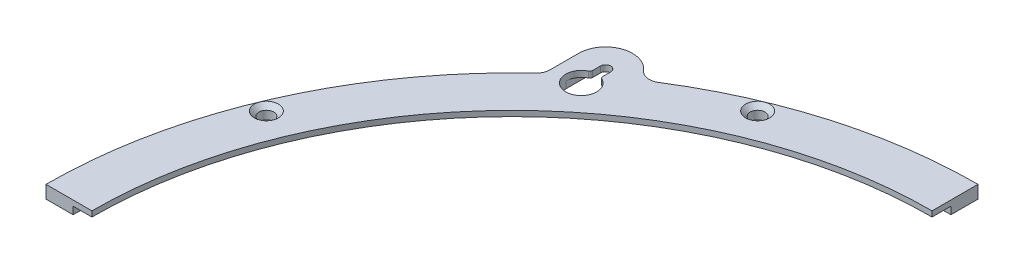
ISO-10303-21;
HEADER;
FILE_DESCRIPTION(('STEP AP214'),'2;1');
FILE_NAME('part.step','',(''),(''),'','','');
FILE_SCHEMA(('AUTOMOTIVE_DESIGN { 1 0 10303 214 1 1 1 1 }'));
ENDSEC;
DATA;
#1=APPLICATION_CONTEXT('core data for automotive mechanical design processes');
#2=APPLICATION_PROTOCOL_DEFINITION('international standard','automotive_design',2000,#1);
#3=PRODUCT_CONTEXT('',#1,'mechanical');
#4=PRODUCT('Part','Part','',(#3));
#5=PRODUCT_RELATED_PRODUCT_CATEGORY('part','',(#4));
#6=PRODUCT_DEFINITION_FORMATION('','',#4);
#7=PRODUCT_DEFINITION_CONTEXT('part definition',#1,'design');
#8=PRODUCT_DEFINITION('design','',#6,#7);
#9=PRODUCT_DEFINITION_SHAPE('','',#8);
#10=(LENGTH_UNIT() NAMED_UNIT(*) SI_UNIT(.MILLI.,.METRE.));
#11=(NAMED_UNIT(*) PLANE_ANGLE_UNIT() SI_UNIT($,.RADIAN.));
#12=(NAMED_UNIT(*) SI_UNIT($,.STERADIAN.) SOLID_ANGLE_UNIT());
#13=UNCERTAINTY_MEASURE_WITH_UNIT(LENGTH_MEASURE(1.E-05),#10,'distance_accuracy_value','');
#14=(GEOMETRIC_REPRESENTATION_CONTEXT(3) GLOBAL_UNCERTAINTY_ASSIGNED_CONTEXT((#13)) GLOBAL_UNIT_ASSIGNED_CONTEXT((#10,
#11,#12)) REPRESENTATION_CONTEXT('',''));
#15=CARTESIAN_POINT('',(0.,0.,0.));
#16=DIRECTION('',(0.,0.,1.));
#17=DIRECTION('',(1.,0.,0.));
#18=AXIS2_PLACEMENT_3D('',#15,#16,#17);
#19=CARTESIAN_POINT('',(-105.914175625585,4.75000000000002,-140.552858300126));
#20=DIRECTION('',(0.,-1.,0.));
#21=DIRECTION('',(0.,0.,-1.));
#22=AXIS2_PLACEMENT_3D('',#19,#20,#21);
#23=CYLINDRICAL_SURFACE('',#22,1.905);
#24=CARTESIAN_POINT('',(-105.914175625585,2.5,-140.552858300126));
#25=DIRECTION('',(0.,1.,0.));
#26=DIRECTION('',(0.,0.,-1.));
#27=AXIS2_PLACEMENT_3D('',#24,#25,#26);
#28=CIRCLE('',#27,1.905);
#29=CARTESIAN_POINT('',(-107.819175625585,2.5,-140.552858300126));
#30=VERTEX_POINT('',#29);
#31=CARTESIAN_POINT('',(-104.009175625585,2.5,-140.552858300126));
#32=VERTEX_POINT('',#31);
#33=EDGE_CURVE('E238',#30,#32,#28,.F.);
#34=ORIENTED_EDGE('',*,*,#33,.T.);
#35=DIRECTION('',(0.,-1.,0.));
#36=VECTOR('',#35,1.);
#37=CARTESIAN_POINT('',(-104.009175625585,4.75000000000002,-140.552858300126));
#38=LINE('',#37,#36);
#39=CARTESIAN_POINT('',(-104.009175625585,4.75000000000002,-140.552858300126));
#40=VERTEX_POINT('',#39);
#41=EDGE_CURVE('E258',#40,#32,#38,.T.);
#42=ORIENTED_EDGE('',*,*,#41,.F.);
#43=CARTESIAN_POINT('',(-105.914175625585,4.75000000000002,-140.552858300126));
#44=DIRECTION('',(0.,1.,0.));
#45=DIRECTION('',(0.,0.,-1.));
#46=AXIS2_PLACEMENT_3D('',#43,#44,#45);
#47=CIRCLE('',#46,1.905);
#48=CARTESIAN_POINT('',(-107.819175625585,4.75000000000002,-140.552858300126));
#49=VERTEX_POINT('',#48);
#50=EDGE_CURVE('E244',#40,#49,#47,.T.);
#51=ORIENTED_EDGE('',*,*,#50,.T.);
#52=DIRECTION('',(0.,-1.,0.));
#53=VECTOR('',#52,1.);
#54=CARTESIAN_POINT('',(-107.819175625585,4.75000000000002,-140.552858300126));
#55=LINE('',#54,#53);
#56=EDGE_CURVE('E255',#49,#30,#55,.T.);
#57=ORIENTED_EDGE('',*,*,#56,.T.);
#58=EDGE_LOOP('',(#34,#42,#51,#57));
#59=FACE_BOUND('',#58,.T.);
#60=ADVANCED_FACE('F34',(#59),#23,.F.);
#61=CARTESIAN_POINT('',(-104.009175625585,4.75000000000002,-136.941011972768));
#62=DIRECTION('',(1.,0.,0.));
#63=DIRECTION('',(0.,0.,1.));
#64=AXIS2_PLACEMENT_3D('',#61,#62,#63);
#65=PLANE('',#64);
#66=DIRECTION('',(0.,0.,1.));
#67=VECTOR('',#66,1.);
#68=CARTESIAN_POINT('',(-104.009175625585,2.5,-136.941011972768));
#69=LINE('',#68,#67);
#70=CARTESIAN_POINT('',(-104.009175625585,2.5,-137.606964344787));
#71=VERTEX_POINT('',#70);
#72=EDGE_CURVE('E242',#32,#71,#69,.T.);
#73=ORIENTED_EDGE('',*,*,#72,.T.);
#74=DIRECTION('',(0.,-1.,0.));
#75=VECTOR('',#74,1.);
#76=CARTESIAN_POINT('',(-104.009175625585,4.75000000000002,-137.606964344787));
#77=LINE('',#76,#75);
#78=CARTESIAN_POINT('',(-104.009175625585,4.75000000000002,-137.606964344787));
#79=VERTEX_POINT('',#78);
#80=EDGE_CURVE('E57',#71,#79,#77,.F.);
#81=ORIENTED_EDGE('',*,*,#80,.T.);
#82=DIRECTION('',(0.,0.,-1.));
#83=VECTOR('',#82,1.);
#84=CARTESIAN_POINT('',(-104.009175625585,4.75000000000002,-136.941011972768));
#85=LINE('',#84,#83);
#86=EDGE_CURVE('E253',#79,#40,#85,.T.);
#87=ORIENTED_EDGE('',*,*,#86,.T.);
#88=ORIENTED_EDGE('',*,*,#41,.T.);
#89=EDGE_LOOP('',(#73,#81,#87,#88));
#90=FACE_BOUND('',#89,.T.);
#91=ADVANCED_FACE('F406',(#90),#65,.F.);
#92=CARTESIAN_POINT('',(-105.914175625585,4.75000000000002,-131.552858300126));
#93=DIRECTION('',(0.,-1.,0.));
#94=DIRECTION('',(0.,0.,-1.));
#95=AXIS2_PLACEMENT_3D('',#92,#93,#94);
#96=CYLINDRICAL_SURFACE('',#95,5.715);
#97=CARTESIAN_POINT('',(-105.914175625585,4.75000000000002,-131.552858300126));
#98=DIRECTION('',(0.,1.,0.));
#99=DIRECTION('',(0.,0.,-1.));
#100=AXIS2_PLACEMENT_3D('',#97,#98,#99);
#101=CIRCLE('',#100,5.715);
#102=CARTESIAN_POINT('',(-108.386562073836,4.75000000000002,-136.705384889141));
#103=VERTEX_POINT('',#102);
#104=CARTESIAN_POINT('',(-103.441789177335,4.75000000000002,-136.705384889141));
#105=VERTEX_POINT('',#104);
#106=EDGE_CURVE('E250',#103,#105,#101,.T.);
#107=ORIENTED_EDGE('',*,*,#106,.T.);
#108=DIRECTION('',(0.,-1.,0.));
#109=VECTOR('',#108,1.);
#110=CARTESIAN_POINT('',(-103.441789177335,4.75000000000002,-136.705384889141));
#111=LINE('',#110,#109);
#112=CARTESIAN_POINT('',(-103.441789177335,2.5,-136.705384889141));
#113=VERTEX_POINT('',#112);
#114=EDGE_CURVE('E387',#105,#113,#111,.T.);
#115=ORIENTED_EDGE('',*,*,#114,.T.);
#116=CARTESIAN_POINT('',(-105.914175625585,2.5,-131.552858300126));
#117=DIRECTION('',(0.,1.,0.));
#118=DIRECTION('',(0.,0.,-1.));
#119=AXIS2_PLACEMENT_3D('',#116,#117,#118);
#120=CIRCLE('',#119,5.715);
#121=CARTESIAN_POINT('',(-100.199175625585,2.5,-131.552858300126));
#122=VERTEX_POINT('',#121);
#123=EDGE_CURVE('E239',#113,#122,#120,.F.);
#124=ORIENTED_EDGE('',*,*,#123,.T.);
#125=DIRECTION('',(0.,-1.,0.));
#126=VECTOR('',#125,1.);
#127=CARTESIAN_POINT('',(-100.199175625585,2.5,-131.552858300126));
#128=LINE('',#127,#126);
#129=CARTESIAN_POINT('',(-100.199175625585,0.,-131.552858300126));
#130=VERTEX_POINT('',#129);
#131=EDGE_CURVE('E233',#122,#130,#128,.T.);
#132=ORIENTED_EDGE('',*,*,#131,.T.);
#133=CARTESIAN_POINT('',(-105.914175625585,0.,-131.552858300126));
#134=DIRECTION('',(0.,1.,0.));
#135=DIRECTION('',(0.,0.,-1.));
#136=AXIS2_PLACEMENT_3D('',#133,#134,#135);
#137=CIRCLE('',#136,5.715);
#138=CARTESIAN_POINT('',(-111.629175625585,0.,-131.552858300126));
#139=VERTEX_POINT('',#138);
#140=EDGE_CURVE('E248',#139,#130,#137,.T.);
#141=ORIENTED_EDGE('',*,*,#140,.F.);
#142=DIRECTION('',(0.,-1.,0.));
#143=VECTOR('',#142,1.);
#144=CARTESIAN_POINT('',(-111.629175625585,2.5,-131.552858300126));
#145=LINE('',#144,#143);
#146=CARTESIAN_POINT('',(-111.629175625585,2.5,-131.552858300126));
#147=VERTEX_POINT('',#146);
#148=EDGE_CURVE('E207',#147,#139,#145,.T.);
#149=ORIENTED_EDGE('',*,*,#148,.F.);
#150=CARTESIAN_POINT('',(-108.386562073836,2.5,-136.705384889141));
#151=VERTEX_POINT('',#150);
#152=EDGE_CURVE('E222',#147,#151,#120,.F.);
#153=ORIENTED_EDGE('',*,*,#152,.T.);
#154=DIRECTION('',(0.,-1.,0.));
#155=VECTOR('',#154,1.);
#156=CARTESIAN_POINT('',(-108.386562073836,4.75000000000002,-136.705384889141));
#157=LINE('',#156,#155);
#158=EDGE_CURVE('E385',#151,#103,#157,.F.);
#159=ORIENTED_EDGE('',*,*,#158,.T.);
#160=EDGE_LOOP('',(#107,#115,#124,#132,#141,#149,#153,#159));
#161=FACE_BOUND('',#160,.T.);
#162=ADVANCED_FACE('F402',(#161),#96,.F.);
#163=CARTESIAN_POINT('',(-107.819175625585,4.75000000000002,-140.552858300126));
#164=DIRECTION('',(-1.,0.,0.));
#165=DIRECTION('',(0.,0.,-1.));
#166=AXIS2_PLACEMENT_3D('',#163,#164,#165);
#167=PLANE('',#166);
#168=DIRECTION('',(0.,0.,1.));
#169=VECTOR('',#168,1.);
#170=CARTESIAN_POINT('',(-107.819175625585,4.75000000000002,-140.552858300126));
#171=LINE('',#170,#169);
#172=CARTESIAN_POINT('',(-107.819175625585,4.75000000000002,-137.606964344787));
#173=VERTEX_POINT('',#172);
#174=EDGE_CURVE('E247',#49,#173,#171,.T.);
#175=ORIENTED_EDGE('',*,*,#174,.T.);
#176=DIRECTION('',(0.,-1.,0.));
#177=VECTOR('',#176,1.);
#178=CARTESIAN_POINT('',(-107.819175625585,4.75000000000002,-137.606964344787));
#179=LINE('',#178,#177);
#180=CARTESIAN_POINT('',(-107.819175625585,2.5,-137.606964344787));
#181=VERTEX_POINT('',#180);
#182=EDGE_CURVE('E11',#173,#181,#179,.T.);
#183=ORIENTED_EDGE('',*,*,#182,.T.);
#184=DIRECTION('',(0.,0.,-1.));
#185=VECTOR('',#184,1.);
#186=CARTESIAN_POINT('',(-107.819175625585,2.5,-140.552858300126));
#187=LINE('',#186,#185);
#188=EDGE_CURVE('E363',#181,#30,#187,.T.);
#189=ORIENTED_EDGE('',*,*,#188,.T.);
#190=ORIENTED_EDGE('',*,*,#56,.F.);
#191=EDGE_LOOP('',(#175,#183,#189,#190));
#192=FACE_BOUND('',#191,.T.);
#193=ADVANCED_FACE('F412',(#192),#167,.F.);
#194=CARTESIAN_POINT('',(0.,0.,0.));
#195=DIRECTION('',(0.,-1.,0.));
#196=DIRECTION('',(0.,0.,-1.));
#197=AXIS2_PLACEMENT_3D('',#194,#195,#196);
#198=CYLINDRICAL_SURFACE('',#197,162.5);
#199=DIRECTION('',(0.,-1.,0.));
#200=VECTOR('',#199,1.);
#201=CARTESIAN_POINT('',(-115.914175625585,0.,-113.886583446168));
#202=LINE('',#201,#200);
#203=CARTESIAN_POINT('',(-115.914175625585,0.,-113.886583446168));
#204=VERTEX_POINT('',#203);
#205=CARTESIAN_POINT('',(-115.914175625585,2.75,-113.886583446168));
#206=VERTEX_POINT('',#205);
#207=EDGE_CURVE('E285',#204,#206,#202,.F.);
#208=ORIENTED_EDGE('',*,*,#207,.T.);
#209=CARTESIAN_POINT('',(0.,2.75,0.));
#210=DIRECTION('',(0.,1.,0.));
#211=DIRECTION('',(0.,0.,-1.));
#212=AXIS2_PLACEMENT_3D('',#209,#210,#211);
#213=CIRCLE('',#212,162.5);
#214=CARTESIAN_POINT('',(-162.5,2.75,0.));
#215=VERTEX_POINT('',#214);
#216=EDGE_CURVE('E349',#206,#215,#213,.T.);
#217=ORIENTED_EDGE('',*,*,#216,.T.);
#218=DIRECTION('',(0.,-1.,0.));
#219=VECTOR('',#218,1.);
#220=CARTESIAN_POINT('',(-162.5,0.,0.));
#221=LINE('',#220,#219);
#222=CARTESIAN_POINT('',(-162.5,0.,0.));
#223=VERTEX_POINT('',#222);
#224=EDGE_CURVE('E330',#223,#215,#221,.F.);
#225=ORIENTED_EDGE('',*,*,#224,.F.);
#226=CARTESIAN_POINT('',(0.,0.,0.));
#227=DIRECTION('',(0.,1.,0.));
#228=DIRECTION('',(0.,0.,-1.));
#229=AXIS2_PLACEMENT_3D('',#226,#227,#228);
#230=CIRCLE('',#229,162.5);
#231=EDGE_CURVE('E353',#204,#223,#230,.T.);
#232=ORIENTED_EDGE('',*,*,#231,.F.);
#233=EDGE_LOOP('',(#208,#217,#225,#232));
#234=FACE_BOUND('',#233,.T.);
#235=ADVANCED_FACE('F483',(#234),#198,.F.);
#236=DIRECTION('',(0.,-1.,0.));
#237=VECTOR('',#236,1.);
#238=CARTESIAN_POINT('',(-115.285932057185,0.,-114.52250376981));
#239=LINE('',#238,#237);
#240=CARTESIAN_POINT('',(-115.285932057185,2.75,-114.52250376981));
#241=VERTEX_POINT('',#240);
#242=CARTESIAN_POINT('',(-115.285932057185,0.,-114.52250376981));
#243=VERTEX_POINT('',#242);
#244=EDGE_CURVE('E290',#241,#243,#239,.T.);
#245=ORIENTED_EDGE('',*,*,#244,.T.);
#246=CARTESIAN_POINT('',(0.,0.,-162.5));
#247=VERTEX_POINT('',#246);
#248=EDGE_CURVE('E354',#247,#243,#230,.T.);
#249=ORIENTED_EDGE('',*,*,#248,.F.);
#250=DIRECTION('',(0.,-1.,0.));
#251=VECTOR('',#250,1.);
#252=CARTESIAN_POINT('',(0.,0.,-162.5));
#253=LINE('',#252,#251);
#254=CARTESIAN_POINT('',(0.,2.75,-162.5));
#255=VERTEX_POINT('',#254);
#256=EDGE_CURVE('E317',#255,#247,#253,.T.);
#257=ORIENTED_EDGE('',*,*,#256,.F.);
#258=EDGE_CURVE('E350',#255,#241,#213,.T.);
#259=ORIENTED_EDGE('',*,*,#258,.T.);
#260=EDGE_LOOP('',(#245,#249,#257,#259));
#261=FACE_BOUND('',#260,.T.);
#262=ADVANCED_FACE('F481',(#261),#198,.F.);
#263=CARTESIAN_POINT('',(162.5,2.75,0.));
#264=DIRECTION('',(0.,1.,0.));
#265=DIRECTION('',(0.,0.,1.));
#266=AXIS2_PLACEMENT_3D('',#263,#264,#265);
#267=PLANE('',#266);
#268=DIRECTION('',(0.,0.,1.));
#269=VECTOR('',#268,1.);
#270=CARTESIAN_POINT('',(-115.914175625585,2.75,-1.44628876197104E-13));
#271=LINE('',#270,#269);
#272=CARTESIAN_POINT('',(-115.914175625585,2.75,-113.837772394641));
#273=VERTEX_POINT('',#272);
#274=EDGE_CURVE('E271',#206,#273,#271,.T.);
#275=ORIENTED_EDGE('',*,*,#274,.T.);
#276=DIRECTION('',(0.676059705588265,0.,-0.736846846013409));
#277=VECTOR('',#276,1.);
#278=CARTESIAN_POINT('',(-45.3716707376606,2.75,-190.723026473382));
#279=LINE('',#278,#277);
#280=EDGE_CURVE('E288',#273,#241,#279,.T.);
#281=ORIENTED_EDGE('',*,*,#280,.T.);
#282=ORIENTED_EDGE('',*,*,#258,.F.);
#283=DIRECTION('',(0.,0.,-1.));
#284=VECTOR('',#283,1.);
#285=CARTESIAN_POINT('',(0.,2.75,0.));
#286=LINE('',#285,#284);
#287=CARTESIAN_POINT('',(0.,2.75,-155.5));
#288=VERTEX_POINT('',#287);
#289=EDGE_CURVE('E315',#288,#255,#286,.T.);
#290=ORIENTED_EDGE('',*,*,#289,.F.);
#291=CARTESIAN_POINT('',(0.,2.75,0.));
#292=DIRECTION('',(0.,1.,0.));
#293=DIRECTION('',(0.,0.,-1.));
#294=AXIS2_PLACEMENT_3D('',#291,#292,#293);
#295=CIRCLE('',#294,155.5);
#296=CARTESIAN_POINT('',(-155.5,2.75,0.));
#297=VERTEX_POINT('',#296);
#298=EDGE_CURVE('E346',#288,#297,#295,.T.);
#299=ORIENTED_EDGE('',*,*,#298,.T.);
#300=DIRECTION('',(1.,0.,0.));
#301=VECTOR('',#300,1.);
#302=CARTESIAN_POINT('',(162.5,2.75,0.));
#303=LINE('',#302,#301);
#304=EDGE_CURVE('E327',#215,#297,#303,.T.);
#305=ORIENTED_EDGE('',*,*,#304,.F.);
#306=ORIENTED_EDGE('',*,*,#216,.F.);
#307=EDGE_LOOP('',(#275,#281,#282,#290,#299,#305,#306));
#308=FACE_BOUND('',#307,.T.);
#309=ADVANCED_FACE('F470',(#308),#267,.F.);
#310=CARTESIAN_POINT('',(0.,0.,0.));
#311=DIRECTION('',(0.,-1.,0.));
#312=DIRECTION('',(0.,0.,-1.));
#313=AXIS2_PLACEMENT_3D('',#310,#311,#312);
#314=CYLINDRICAL_SURFACE('',#313,172.5);
#315=CARTESIAN_POINT('',(0.,4.75,0.));
#316=DIRECTION('',(0.,1.,0.));
#317=DIRECTION('',(0.,0.,-1.));
#318=AXIS2_PLACEMENT_3D('',#315,#316,#317);
#319=CIRCLE('',#318,172.5);
#320=CARTESIAN_POINT('',(0.,4.75,-172.5));
#321=VERTEX_POINT('',#320);
#322=CARTESIAN_POINT('',(-91.8207968190723,4.75,-146.031473564813));
#323=VERTEX_POINT('',#322);
#324=EDGE_CURVE('E340',#321,#323,#319,.T.);
#325=ORIENTED_EDGE('',*,*,#324,.F.);
#326=DIRECTION('',(0.,-1.,0.));
#327=VECTOR('',#326,1.);
#328=CARTESIAN_POINT('',(0.,0.,-172.5));
#329=LINE('',#328,#327);
#330=CARTESIAN_POINT('',(0.,0.,-172.5));
#331=VERTEX_POINT('',#330);
#332=EDGE_CURVE('E357',#331,#321,#329,.F.);
#333=ORIENTED_EDGE('',*,*,#332,.F.);
#334=CARTESIAN_POINT('',(0.,0.,0.));
#335=DIRECTION('',(0.,1.,0.));
#336=DIRECTION('',(0.,0.,-1.));
#337=AXIS2_PLACEMENT_3D('',#334,#335,#336);
#338=CIRCLE('',#337,172.5);
#339=CARTESIAN_POINT('',(-91.8207968190723,0.,-146.031473564813));
#340=VERTEX_POINT('',#339);
#341=EDGE_CURVE('E336',#331,#340,#338,.T.);
#342=ORIENTED_EDGE('',*,*,#341,.T.);
#343=DIRECTION('',(0.,-1.,0.));
#344=VECTOR('',#343,1.);
#345=CARTESIAN_POINT('',(-91.8207968190723,0.,-146.031473564813));
#346=LINE('',#345,#344);
#347=EDGE_CURVE('E367',#323,#340,#346,.T.);
#348=ORIENTED_EDGE('',*,*,#347,.F.);
#349=EDGE_LOOP('',(#325,#333,#342,#348));
#350=FACE_BOUND('',#349,.T.);
#351=ADVANCED_FACE('F466',(#350),#314,.T.);
#352=CARTESIAN_POINT('',(-117.508142509372,0.,-126.285733335152));
#353=VERTEX_POINT('',#352);
#354=CARTESIAN_POINT('',(-172.5,0.,0.));
#355=VERTEX_POINT('',#354);
#356=EDGE_CURVE('E335',#353,#355,#338,.T.);
#357=ORIENTED_EDGE('',*,*,#356,.T.);
#358=DIRECTION('',(0.,-1.,0.));
#359=VECTOR('',#358,1.);
#360=CARTESIAN_POINT('',(-172.5,0.,0.));
#361=LINE('',#360,#359);
#362=CARTESIAN_POINT('',(-172.5,4.75,0.));
#363=VERTEX_POINT('',#362);
#364=EDGE_CURVE('E360',#363,#355,#361,.T.);
#365=ORIENTED_EDGE('',*,*,#364,.F.);
#366=CARTESIAN_POINT('',(-117.508142509372,4.75,-126.285733335152));
#367=VERTEX_POINT('',#366);
#368=EDGE_CURVE('E339',#367,#363,#319,.T.);
#369=ORIENTED_EDGE('',*,*,#368,.F.);
#370=DIRECTION('',(0.,-1.,0.));
#371=VECTOR('',#370,1.);
#372=CARTESIAN_POINT('',(-117.508142509372,0.,-126.285733335152));
#373=LINE('',#372,#371);
#374=EDGE_CURVE('E372',#353,#367,#373,.F.);
#375=ORIENTED_EDGE('',*,*,#374,.F.);
#376=EDGE_LOOP('',(#357,#365,#369,#375));
#377=FACE_BOUND('',#376,.T.);
#378=ADVANCED_FACE('F469',(#377),#314,.T.);
#379=CARTESIAN_POINT('',(172.5,0.,0.));
#380=DIRECTION('',(0.,1.,0.));
#381=DIRECTION('',(0.,0.,1.));
#382=AXIS2_PLACEMENT_3D('',#379,#380,#381);
#383=PLANE('',#382);
#384=CARTESIAN_POINT('',(-105.914175625585,0.,-140.552858300126));
#385=DIRECTION('',(0.,1.,0.));
#386=DIRECTION('',(0.,0.,-1.));
#387=AXIS2_PLACEMENT_3D('',#384,#385,#386);
#388=CIRCLE('',#387,5.71499999999997);
#389=CARTESIAN_POINT('',(-100.199175625585,0.,-140.552858300126));
#390=VERTEX_POINT('',#389);
#391=CARTESIAN_POINT('',(-111.629175625585,0.,-140.552858300126));
#392=VERTEX_POINT('',#391);
#393=EDGE_CURVE('E227',#390,#392,#388,.T.);
#394=ORIENTED_EDGE('',*,*,#393,.T.);
#395=DIRECTION('',(0.,0.,1.));
#396=VECTOR('',#395,1.);
#397=CARTESIAN_POINT('',(-111.629175625585,0.,-140.552858300126));
#398=LINE('',#397,#396);
#399=EDGE_CURVE('E203',#392,#139,#398,.T.);
#400=ORIENTED_EDGE('',*,*,#399,.T.);
#401=ORIENTED_EDGE('',*,*,#140,.T.);
#402=DIRECTION('',(0.,0.,-1.));
#403=VECTOR('',#402,1.);
#404=CARTESIAN_POINT('',(-100.199175625585,0.,-131.552858300126));
#405=LINE('',#404,#403);
#406=EDGE_CURVE('E217',#130,#390,#405,.T.);
#407=ORIENTED_EDGE('',*,*,#406,.T.);
#408=EDGE_LOOP('',(#394,#400,#401,#407));
#409=FACE_BOUND('',#408,.T.);
#410=ORIENTED_EDGE('',*,*,#341,.F.);
#411=DIRECTION('',(0.,0.,-1.));
#412=VECTOR('',#411,1.);
#413=CARTESIAN_POINT('',(0.,0.,0.));
#414=LINE('',#413,#412);
#415=EDGE_CURVE('E320',#247,#331,#414,.T.);
#416=ORIENTED_EDGE('',*,*,#415,.F.);
#417=ORIENTED_EDGE('',*,*,#248,.T.);
#418=DIRECTION('',(-0.676059705588265,0.,0.736846846013409));
#419=VECTOR('',#418,1.);
#420=CARTESIAN_POINT('',(-95.9141756255854,0.,-135.63604967467));
#421=LINE('',#420,#419);
#422=CARTESIAN_POINT('',(-115.914175625585,0.,-113.837772394641));
#423=VERTEX_POINT('',#422);
#424=EDGE_CURVE('E261',#243,#423,#421,.T.);
#425=ORIENTED_EDGE('',*,*,#424,.T.);
#426=DIRECTION('',(0.,0.,-1.));
#427=VECTOR('',#426,1.);
#428=CARTESIAN_POINT('',(-115.914175625585,0.,-113.837772394641));
#429=LINE('',#428,#427);
#430=EDGE_CURVE('E275',#423,#204,#429,.T.);
#431=ORIENTED_EDGE('',*,*,#430,.T.);
#432=ORIENTED_EDGE('',*,*,#231,.T.);
#433=DIRECTION('',(1.,0.,0.));
#434=VECTOR('',#433,1.);
#435=CARTESIAN_POINT('',(172.5,0.,0.));
#436=LINE('',#435,#434);
#437=EDGE_CURVE('E333',#355,#223,#436,.T.);
#438=ORIENTED_EDGE('',*,*,#437,.F.);
#439=ORIENTED_EDGE('',*,*,#356,.F.);
#440=CARTESIAN_POINT('',(-120.914175625585,0.,-129.946189373852));
#441=DIRECTION('',(0.,-1.,0.));
#442=DIRECTION('',(0.,0.,1.));
#443=AXIS2_PLACEMENT_3D('',#440,#441,#442);
#444=CIRCLE('',#443,5.);
#445=CARTESIAN_POINT('',(-115.914175625585,0.,-129.946189373852));
#446=VERTEX_POINT('',#445);
#447=EDGE_CURVE('E380',#446,#353,#444,.T.);
#448=ORIENTED_EDGE('',*,*,#447,.F.);
#449=CARTESIAN_POINT('',(-115.914175625585,0.,-140.552858300126));
#450=VERTEX_POINT('',#449);
#451=EDGE_CURVE('E274',#446,#450,#429,.T.);
#452=ORIENTED_EDGE('',*,*,#451,.T.);
#453=CARTESIAN_POINT('',(-105.914175625585,0.,-140.552858300126));
#454=DIRECTION('',(0.,-1.,0.));
#455=DIRECTION('',(0.,0.,1.));
#456=AXIS2_PLACEMENT_3D('',#453,#454,#455);
#457=CIRCLE('',#456,9.99999999999999);
#458=CARTESIAN_POINT('',(-98.2929046689548,0.,-147.027132700059));
#459=VERTEX_POINT('',#458);
#460=EDGE_CURVE('E277',#450,#459,#457,.T.);
#461=ORIENTED_EDGE('',*,*,#460,.T.);
#462=CARTESIAN_POINT('',(-94.4822691906396,0.,-150.264269900025));
#463=DIRECTION('',(0.,-1.,0.));
#464=DIRECTION('',(0.,0.,1.));
#465=AXIS2_PLACEMENT_3D('',#462,#463,#464);
#466=CIRCLE('',#465,5.);
#467=EDGE_CURVE('E377',#340,#459,#466,.T.);
#468=ORIENTED_EDGE('',*,*,#467,.F.);
#469=EDGE_LOOP('',(#410,#416,#417,#425,#431,#432,#438,#439,#448,#452,#461,#468));
#470=FACE_BOUND('',#469,.T.);
#471=CARTESIAN_POINT('',(-64.2908166373347,0.,-155.211761461896));
#472=DIRECTION('',(0.,-1.,0.));
#473=DIRECTION('',(0.,0.,1.));
#474=AXIS2_PLACEMENT_3D('',#471,#472,#473);
#475=CIRCLE('',#474,2.749999961);
#476=CARTESIAN_POINT('',(-64.2908166373347,0.,-152.461761500896));
#477=VERTEX_POINT('',#476);
#478=EDGE_CURVE('E299',#477,#477,#475,.T.);
#479=ORIENTED_EDGE('',*,*,#478,.F.);
#480=EDGE_LOOP('',(#479));
#481=FACE_BOUND('',#480,.T.);
#482=CARTESIAN_POINT('',(-155.211761461896,0.,-64.2908166373352));
#483=DIRECTION('',(0.,-1.,0.));
#484=DIRECTION('',(0.,0.,1.));
#485=AXIS2_PLACEMENT_3D('',#482,#483,#484);
#486=CIRCLE('',#485,2.749999961);
#487=CARTESIAN_POINT('',(-155.211761461896,0.,-61.5408166763352));
#488=VERTEX_POINT('',#487);
#489=EDGE_CURVE('E308',#488,#488,#486,.T.);
#490=ORIENTED_EDGE('',*,*,#489,.F.);
#491=EDGE_LOOP('',(#490));
#492=FACE_BOUND('',#491,.T.);
#493=ADVANCED_FACE('F477',(#409,#470,#481,#492),#383,.F.);
#494=CARTESIAN_POINT('',(0.,0.,0.));
#495=DIRECTION('',(0.,-1.,0.));
#496=DIRECTION('',(0.,0.,-1.));
#497=AXIS2_PLACEMENT_3D('',#494,#495,#496);
#498=CYLINDRICAL_SURFACE('',#497,155.5);
#499=ORIENTED_EDGE('',*,*,#298,.F.);
#500=DIRECTION('',(0.,-1.,0.));
#501=VECTOR('',#500,1.);
#502=CARTESIAN_POINT('',(0.,0.,-155.5));
#503=LINE('',#502,#501);
#504=CARTESIAN_POINT('',(0.,4.75,-155.5));
#505=VERTEX_POINT('',#504);
#506=EDGE_CURVE('E313',#505,#288,#503,.T.);
#507=ORIENTED_EDGE('',*,*,#506,.F.);
#508=CARTESIAN_POINT('',(0.,4.75,0.));
#509=DIRECTION('',(0.,1.,0.));
#510=DIRECTION('',(0.,0.,-1.));
#511=AXIS2_PLACEMENT_3D('',#508,#509,#510);
#512=CIRCLE('',#511,155.5);
#513=CARTESIAN_POINT('',(-155.5,4.75,0.));
#514=VERTEX_POINT('',#513);
#515=EDGE_CURVE('E343',#505,#514,#512,.T.);
#516=ORIENTED_EDGE('',*,*,#515,.T.);
#517=DIRECTION('',(0.,-1.,0.));
#518=VECTOR('',#517,1.);
#519=CARTESIAN_POINT('',(-155.5,0.,0.));
#520=LINE('',#519,#518);
#521=EDGE_CURVE('E324',#297,#514,#520,.F.);
#522=ORIENTED_EDGE('',*,*,#521,.F.);
#523=EDGE_LOOP('',(#499,#507,#516,#522));
#524=FACE_BOUND('',#523,.T.);
#525=ADVANCED_FACE('F474',(#524),#498,.F.);
#526=CARTESIAN_POINT('',(155.5,4.75,0.));
#527=DIRECTION('',(0.,-1.,0.));
#528=DIRECTION('',(0.,0.,-1.));
#529=AXIS2_PLACEMENT_3D('',#526,#527,#528);
#530=PLANE('',#529);
#531=ORIENTED_EDGE('',*,*,#86,.F.);
#532=CARTESIAN_POINT('',(-103.009175625585,4.75,-137.606964344787));
#533=DIRECTION('',(0.,-1.,0.));
#534=DIRECTION('',(0.,0.,-1.));
#535=AXIS2_PLACEMENT_3D('',#532,#533,#534);
#536=CIRCLE('',#535,1.);
#537=EDGE_CURVE('E42',#79,#105,#536,.F.);
#538=ORIENTED_EDGE('',*,*,#537,.T.);
#539=ORIENTED_EDGE('',*,*,#106,.F.);
#540=CARTESIAN_POINT('',(-108.819175625585,4.75,-137.606964344787));
#541=DIRECTION('',(0.,-1.,0.));
#542=DIRECTION('',(0.,0.,-1.));
#543=AXIS2_PLACEMENT_3D('',#540,#541,#542);
#544=CIRCLE('',#543,1.);
#545=EDGE_CURVE('E49',#103,#173,#544,.F.);
#546=ORIENTED_EDGE('',*,*,#545,.T.);
#547=ORIENTED_EDGE('',*,*,#174,.F.);
#548=ORIENTED_EDGE('',*,*,#50,.F.);
#549=EDGE_LOOP('',(#531,#538,#539,#546,#547,#548));
#550=FACE_BOUND('',#549,.T.);
#551=ORIENTED_EDGE('',*,*,#368,.T.);
#552=DIRECTION('',(-1.,0.,0.));
#553=VECTOR('',#552,1.);
#554=CARTESIAN_POINT('',(155.5,4.75,0.));
#555=LINE('',#554,#553);
#556=EDGE_CURVE('E322',#514,#363,#555,.T.);
#557=ORIENTED_EDGE('',*,*,#556,.F.);
#558=ORIENTED_EDGE('',*,*,#515,.F.);
#559=DIRECTION('',(0.,0.,1.));
#560=VECTOR('',#559,1.);
#561=CARTESIAN_POINT('',(0.,4.75,0.));
#562=LINE('',#561,#560);
#563=EDGE_CURVE('E311',#321,#505,#562,.T.);
#564=ORIENTED_EDGE('',*,*,#563,.F.);
#565=ORIENTED_EDGE('',*,*,#324,.T.);
#566=CARTESIAN_POINT('',(-94.4822691906396,4.75,-150.264269900025));
#567=DIRECTION('',(0.,1.,0.));
#568=DIRECTION('',(0.,0.,-1.));
#569=AXIS2_PLACEMENT_3D('',#566,#567,#568);
#570=CIRCLE('',#569,5.);
#571=CARTESIAN_POINT('',(-98.2929046689548,4.75,-147.027132700059));
#572=VERTEX_POINT('',#571);
#573=EDGE_CURVE('E375',#572,#323,#570,.T.);
#574=ORIENTED_EDGE('',*,*,#573,.F.);
#575=CARTESIAN_POINT('',(-105.914175625585,4.75,-140.552858300126));
#576=DIRECTION('',(0.,1.,0.));
#577=DIRECTION('',(0.,0.,-1.));
#578=AXIS2_PLACEMENT_3D('',#575,#576,#577);
#579=CIRCLE('',#578,9.99999999999999);
#580=CARTESIAN_POINT('',(-115.914175625585,4.75,-140.552858300126));
#581=VERTEX_POINT('',#580);
#582=EDGE_CURVE('E264',#572,#581,#579,.T.);
#583=ORIENTED_EDGE('',*,*,#582,.T.);
#584=DIRECTION('',(0.,0.,1.));
#585=VECTOR('',#584,1.);
#586=CARTESIAN_POINT('',(-115.914175625585,4.75,-113.837772394641));
#587=LINE('',#586,#585);
#588=CARTESIAN_POINT('',(-115.914175625585,4.75,-129.946189373852));
#589=VERTEX_POINT('',#588);
#590=EDGE_CURVE('E267',#581,#589,#587,.T.);
#591=ORIENTED_EDGE('',*,*,#590,.T.);
#592=CARTESIAN_POINT('',(-120.914175625585,4.75,-129.946189373852));
#593=DIRECTION('',(0.,1.,0.));
#594=DIRECTION('',(0.,0.,-1.));
#595=AXIS2_PLACEMENT_3D('',#592,#593,#594);
#596=CIRCLE('',#595,5.);
#597=EDGE_CURVE('E382',#367,#589,#596,.T.);
#598=ORIENTED_EDGE('',*,*,#597,.F.);
#599=EDGE_LOOP('',(#551,#557,#558,#564,#565,#574,#583,#591,#598));
#600=FACE_BOUND('',#599,.T.);
#601=CARTESIAN_POINT('',(-155.211761461896,4.75000000000001,-64.2908166373352));
#602=DIRECTION('',(0.,-1.,0.));
#603=DIRECTION('',(0.,0.,1.));
#604=AXIS2_PLACEMENT_3D('',#601,#602,#603);
#605=CIRCLE('',#604,4.445);
#606=CARTESIAN_POINT('',(-155.211761461896,4.75000000000001,-59.8458166373352));
#607=VERTEX_POINT('',#606);
#608=EDGE_CURVE('E302',#607,#607,#605,.T.);
#609=ORIENTED_EDGE('',*,*,#608,.T.);
#610=EDGE_LOOP('',(#609));
#611=FACE_BOUND('',#610,.T.);
#612=CARTESIAN_POINT('',(-64.2908166373347,4.75000000000001,-155.211761461896));
#613=DIRECTION('',(0.,-1.,0.));
#614=DIRECTION('',(0.,0.,1.));
#615=AXIS2_PLACEMENT_3D('',#612,#613,#614);
#616=CIRCLE('',#615,4.445);
#617=CARTESIAN_POINT('',(-64.2908166373347,4.75000000000001,-150.766761461896));
#618=VERTEX_POINT('',#617);
#619=EDGE_CURVE('E293',#618,#618,#616,.T.);
#620=ORIENTED_EDGE('',*,*,#619,.T.);
#621=EDGE_LOOP('',(#620));
#622=FACE_BOUND('',#621,.T.);
#623=ADVANCED_FACE('F396',(#550,#600,#611,#622),#530,.F.);
#624=CARTESIAN_POINT('',(0.,-25.4,0.));
#625=DIRECTION('',(-1.,0.,0.));
#626=DIRECTION('',(0.,0.,-1.));
#627=AXIS2_PLACEMENT_3D('',#624,#625,#626);
#628=PLANE('',#627);
#629=ORIENTED_EDGE('',*,*,#256,.T.);
#630=ORIENTED_EDGE('',*,*,#415,.T.);
#631=ORIENTED_EDGE('',*,*,#332,.T.);
#632=ORIENTED_EDGE('',*,*,#563,.T.);
#633=ORIENTED_EDGE('',*,*,#506,.T.);
#634=ORIENTED_EDGE('',*,*,#289,.T.);
#635=EDGE_LOOP('',(#629,#630,#631,#632,#633,#634));
#636=FACE_BOUND('',#635,.T.);
#637=ADVANCED_FACE('F459',(#636),#628,.F.);
#638=CARTESIAN_POINT('',(0.,-25.4,0.));
#639=DIRECTION('',(0.,0.,-1.));
#640=DIRECTION('',(1.,0.,0.));
#641=AXIS2_PLACEMENT_3D('',#638,#639,#640);
#642=PLANE('',#641);
#643=ORIENTED_EDGE('',*,*,#364,.T.);
#644=ORIENTED_EDGE('',*,*,#437,.T.);
#645=ORIENTED_EDGE('',*,*,#224,.T.);
#646=ORIENTED_EDGE('',*,*,#304,.T.);
#647=ORIENTED_EDGE('',*,*,#521,.T.);
#648=ORIENTED_EDGE('',*,*,#556,.T.);
#649=EDGE_LOOP('',(#643,#644,#645,#646,#647,#648));
#650=FACE_BOUND('',#649,.T.);
#651=ADVANCED_FACE('F457',(#650),#642,.F.);
#652=CARTESIAN_POINT('',(-155.211761461896,4.75,-64.2908166373352));
#653=DIRECTION('',(0.,1.,0.));
#654=DIRECTION('',(0.,0.,1.));
#655=AXIS2_PLACEMENT_3D('',#652,#653,#654);
#656=CYLINDRICAL_SURFACE('',#655,2.749999961);
#657=ORIENTED_EDGE('',*,*,#489,.T.);
#658=EDGE_LOOP('',(#657));
#659=FACE_BOUND('',#658,.T.);
#660=CARTESIAN_POINT('',(-155.211761461896,3.054999961,-64.2908166373352));
#661=DIRECTION('',(0.,-1.,0.));
#662=DIRECTION('',(0.,0.,1.));
#663=AXIS2_PLACEMENT_3D('',#660,#661,#662);
#664=CIRCLE('',#663,2.749999961);
#665=CARTESIAN_POINT('',(-155.211761461896,3.054999961,-61.5408166763352));
#666=VERTEX_POINT('',#665);
#667=EDGE_CURVE('E305',#666,#666,#664,.T.);
#668=ORIENTED_EDGE('',*,*,#667,.F.);
#669=EDGE_LOOP('',(#668));
#670=FACE_BOUND('',#669,.T.);
#671=ADVANCED_FACE('F453',(#659,#670),#656,.F.);
#672=CARTESIAN_POINT('',(-155.211761461896,4.75000000000001,-64.2908166373352));
#673=DIRECTION('',(0.,1.,0.));
#674=DIRECTION('',(0.,0.,1.));
#675=AXIS2_PLACEMENT_3D('',#672,#673,#674);
#676=CONICAL_SURFACE('',#675,4.445,0.785398163397448);
#677=ORIENTED_EDGE('',*,*,#667,.T.);
#678=EDGE_LOOP('',(#677));
#679=FACE_BOUND('',#678,.T.);
#680=ORIENTED_EDGE('',*,*,#608,.F.);
#681=EDGE_LOOP('',(#680));
#682=FACE_BOUND('',#681,.T.);
#683=ADVANCED_FACE('F449',(#679,#682),#676,.F.);
#684=CARTESIAN_POINT('',(-64.2908166373347,4.75,-155.211761461896));
#685=DIRECTION('',(0.,1.,0.));
#686=DIRECTION('',(0.,0.,1.));
#687=AXIS2_PLACEMENT_3D('',#684,#685,#686);
#688=CYLINDRICAL_SURFACE('',#687,2.749999961);
#689=ORIENTED_EDGE('',*,*,#478,.T.);
#690=EDGE_LOOP('',(#689));
#691=FACE_BOUND('',#690,.T.);
#692=CARTESIAN_POINT('',(-64.2908166373347,3.054999961,-155.211761461896));
#693=DIRECTION('',(0.,-1.,0.));
#694=DIRECTION('',(0.,0.,1.));
#695=AXIS2_PLACEMENT_3D('',#692,#693,#694);
#696=CIRCLE('',#695,2.749999961);
#697=CARTESIAN_POINT('',(-64.2908166373347,3.054999961,-152.461761500896));
#698=VERTEX_POINT('',#697);
#699=EDGE_CURVE('E296',#698,#698,#696,.T.);
#700=ORIENTED_EDGE('',*,*,#699,.F.);
#701=EDGE_LOOP('',(#700));
#702=FACE_BOUND('',#701,.T.);
#703=ADVANCED_FACE('F445',(#691,#702),#688,.F.);
#704=CARTESIAN_POINT('',(-64.2908166373347,4.75000000000001,-155.211761461896));
#705=DIRECTION('',(0.,1.,0.));
#706=DIRECTION('',(0.,0.,1.));
#707=AXIS2_PLACEMENT_3D('',#704,#705,#706);
#708=CONICAL_SURFACE('',#707,4.445,0.785398163397448);
#709=ORIENTED_EDGE('',*,*,#699,.T.);
#710=EDGE_LOOP('',(#709));
#711=FACE_BOUND('',#710,.T.);
#712=ORIENTED_EDGE('',*,*,#619,.F.);
#713=EDGE_LOOP('',(#712));
#714=FACE_BOUND('',#713,.T.);
#715=ADVANCED_FACE('F442',(#711,#714),#708,.F.);
#716=CARTESIAN_POINT('',(-115.914175625585,46.5590604181341,-113.837772394641));
#717=DIRECTION('',(1.,0.,0.));
#718=DIRECTION('',(0.,0.,1.));
#719=AXIS2_PLACEMENT_3D('',#716,#717,#718);
#720=PLANE('',#719);
#721=ORIENTED_EDGE('',*,*,#590,.F.);
#722=DIRECTION('',(0.,-1.,0.));
#723=VECTOR('',#722,1.);
#724=CARTESIAN_POINT('',(-115.914175625585,46.5590604181341,-140.552858300126));
#725=LINE('',#724,#723);
#726=EDGE_CURVE('E280',#581,#450,#725,.T.);
#727=ORIENTED_EDGE('',*,*,#726,.T.);
#728=ORIENTED_EDGE('',*,*,#451,.F.);
#729=DIRECTION('',(0.,1.,0.));
#730=VECTOR('',#729,1.);
#731=CARTESIAN_POINT('',(-115.914175625585,0.,-129.946189373852));
#732=LINE('',#731,#730);
#733=EDGE_CURVE('E370',#589,#446,#732,.F.);
#734=ORIENTED_EDGE('',*,*,#733,.F.);
#735=EDGE_LOOP('',(#721,#727,#728,#734));
#736=FACE_BOUND('',#735,.T.);
#737=ADVANCED_FACE('F433',(#736),#720,.F.);
#738=CARTESIAN_POINT('',(-105.914175625585,46.5590604181341,-140.552858300126));
#739=DIRECTION('',(0.,-1.,0.));
#740=DIRECTION('',(0.,0.,-1.));
#741=AXIS2_PLACEMENT_3D('',#738,#739,#740);
#742=CYLINDRICAL_SURFACE('',#741,9.99999999999999);
#743=ORIENTED_EDGE('',*,*,#460,.F.);
#744=ORIENTED_EDGE('',*,*,#726,.F.);
#745=ORIENTED_EDGE('',*,*,#582,.F.);
#746=DIRECTION('',(0.,-1.,0.));
#747=VECTOR('',#746,1.);
#748=CARTESIAN_POINT('',(-98.2929046689548,46.5590604181341,-147.027132700059));
#749=LINE('',#748,#747);
#750=EDGE_CURVE('E365',#459,#572,#749,.F.);
#751=ORIENTED_EDGE('',*,*,#750,.F.);
#752=EDGE_LOOP('',(#743,#744,#745,#751));
#753=FACE_BOUND('',#752,.T.);
#754=ADVANCED_FACE('F429',(#753),#742,.T.);
#755=CARTESIAN_POINT('',(-95.9141756255854,46.5590604181341,-135.63604967467));
#756=DIRECTION('',(-0.736846846013409,0.,-0.676059705588265));
#757=DIRECTION('',(0.676059705588265,0.,-0.736846846013409));
#758=AXIS2_PLACEMENT_3D('',#755,#756,#757);
#759=PLANE('',#758);
#760=ORIENTED_EDGE('',*,*,#280,.F.);
#761=DIRECTION('',(0.,-1.,0.));
#762=VECTOR('',#761,1.);
#763=CARTESIAN_POINT('',(-115.914175625585,46.5590604181341,-113.837772394641));
#764=LINE('',#763,#762);
#765=EDGE_CURVE('E268',#273,#423,#764,.T.);
#766=ORIENTED_EDGE('',*,*,#765,.T.);
#767=ORIENTED_EDGE('',*,*,#424,.F.);
#768=ORIENTED_EDGE('',*,*,#244,.F.);
#769=EDGE_LOOP('',(#760,#766,#767,#768));
#770=FACE_BOUND('',#769,.T.);
#771=ADVANCED_FACE('F432',(#770),#759,.F.);
#772=ORIENTED_EDGE('',*,*,#430,.F.);
#773=ORIENTED_EDGE('',*,*,#765,.F.);
#774=ORIENTED_EDGE('',*,*,#274,.F.);
#775=ORIENTED_EDGE('',*,*,#207,.F.);
#776=EDGE_LOOP('',(#772,#773,#774,#775));
#777=FACE_BOUND('',#776,.T.);
#778=ADVANCED_FACE('F435',(#777),#720,.F.);
#779=CARTESIAN_POINT('',(-105.914175625585,2.5,-140.552858300126));
#780=DIRECTION('',(0.,-1.,0.));
#781=DIRECTION('',(0.,0.,-1.));
#782=AXIS2_PLACEMENT_3D('',#779,#780,#781);
#783=PLANE('',#782);
#784=ORIENTED_EDGE('',*,*,#123,.F.);
#785=CARTESIAN_POINT('',(-103.009175625585,2.5,-137.606964344787));
#786=DIRECTION('',(0.,-1.,0.));
#787=DIRECTION('',(0.,0.,-1.));
#788=AXIS2_PLACEMENT_3D('',#785,#786,#787);
#789=CIRCLE('',#788,1.);
#790=EDGE_CURVE('E392',#113,#71,#789,.T.);
#791=ORIENTED_EDGE('',*,*,#790,.T.);
#792=ORIENTED_EDGE('',*,*,#72,.F.);
#793=ORIENTED_EDGE('',*,*,#33,.F.);
#794=ORIENTED_EDGE('',*,*,#188,.F.);
#795=CARTESIAN_POINT('',(-108.819175625585,2.5,-137.606964344787));
#796=DIRECTION('',(0.,-1.,0.));
#797=DIRECTION('',(0.,0.,-1.));
#798=AXIS2_PLACEMENT_3D('',#795,#796,#797);
#799=CIRCLE('',#798,1.);
#800=EDGE_CURVE('E390',#181,#151,#799,.T.);
#801=ORIENTED_EDGE('',*,*,#800,.T.);
#802=ORIENTED_EDGE('',*,*,#152,.F.);
#803=DIRECTION('',(0.,0.,1.));
#804=VECTOR('',#803,1.);
#805=CARTESIAN_POINT('',(-111.629175625585,2.5,-140.552858300126));
#806=LINE('',#805,#804);
#807=CARTESIAN_POINT('',(-111.629175625585,2.5,-140.552858300126));
#808=VERTEX_POINT('',#807);
#809=EDGE_CURVE('E201',#808,#147,#806,.T.);
#810=ORIENTED_EDGE('',*,*,#809,.F.);
#811=CARTESIAN_POINT('',(-105.914175625585,2.5,-140.552858300126));
#812=DIRECTION('',(0.,1.,0.));
#813=DIRECTION('',(0.,0.,-1.));
#814=AXIS2_PLACEMENT_3D('',#811,#812,#813);
#815=CIRCLE('',#814,5.71499999999997);
#816=CARTESIAN_POINT('',(-100.199175625585,2.5,-140.552858300126));
#817=VERTEX_POINT('',#816);
#818=EDGE_CURVE('E211',#817,#808,#815,.T.);
#819=ORIENTED_EDGE('',*,*,#818,.F.);
#820=DIRECTION('',(0.,0.,-1.));
#821=VECTOR('',#820,1.);
#822=CARTESIAN_POINT('',(-100.199175625585,2.5,-131.552858300126));
#823=LINE('',#822,#821);
#824=EDGE_CURVE('E208',#122,#817,#823,.T.);
#825=ORIENTED_EDGE('',*,*,#824,.F.);
#826=EDGE_LOOP('',(#784,#791,#792,#793,#794,#801,#802,#810,#819,#825));
#827=FACE_BOUND('',#826,.T.);
#828=ADVANCED_FACE('F220',(#827),#783,.T.);
#829=CARTESIAN_POINT('',(-105.914175625585,2.5,-140.552858300126));
#830=DIRECTION('',(0.,-1.,0.));
#831=DIRECTION('',(0.,0.,-1.));
#832=AXIS2_PLACEMENT_3D('',#829,#830,#831);
#833=CYLINDRICAL_SURFACE('',#832,5.71499999999997);
#834=ORIENTED_EDGE('',*,*,#393,.F.);
#835=DIRECTION('',(0.,-1.,0.));
#836=VECTOR('',#835,1.);
#837=CARTESIAN_POINT('',(-100.199175625585,2.5,-140.552858300126));
#838=LINE('',#837,#836);
#839=EDGE_CURVE('E213',#817,#390,#838,.T.);
#840=ORIENTED_EDGE('',*,*,#839,.F.);
#841=ORIENTED_EDGE('',*,*,#818,.T.);
#842=DIRECTION('',(0.,-1.,0.));
#843=VECTOR('',#842,1.);
#844=CARTESIAN_POINT('',(-111.629175625585,2.5,-140.552858300126));
#845=LINE('',#844,#843);
#846=EDGE_CURVE('E196',#808,#392,#845,.T.);
#847=ORIENTED_EDGE('',*,*,#846,.T.);
#848=EDGE_LOOP('',(#834,#840,#841,#847));
#849=FACE_BOUND('',#848,.T.);
#850=ADVANCED_FACE('F212',(#849),#833,.F.);
#851=CARTESIAN_POINT('',(-100.199175625585,2.5,-131.552858300126));
#852=DIRECTION('',(1.,0.,0.));
#853=DIRECTION('',(0.,0.,1.));
#854=AXIS2_PLACEMENT_3D('',#851,#852,#853);
#855=PLANE('',#854);
#856=ORIENTED_EDGE('',*,*,#406,.F.);
#857=ORIENTED_EDGE('',*,*,#131,.F.);
#858=ORIENTED_EDGE('',*,*,#824,.T.);
#859=ORIENTED_EDGE('',*,*,#839,.T.);
#860=EDGE_LOOP('',(#856,#857,#858,#859));
#861=FACE_BOUND('',#860,.T.);
#862=ADVANCED_FACE('F623',(#861),#855,.F.);
#863=CARTESIAN_POINT('',(-111.629175625585,2.5,-140.552858300126));
#864=DIRECTION('',(-1.,0.,0.));
#865=DIRECTION('',(0.,0.,-1.));
#866=AXIS2_PLACEMENT_3D('',#863,#864,#865);
#867=PLANE('',#866);
#868=ORIENTED_EDGE('',*,*,#399,.F.);
#869=ORIENTED_EDGE('',*,*,#846,.F.);
#870=ORIENTED_EDGE('',*,*,#809,.T.);
#871=ORIENTED_EDGE('',*,*,#148,.T.);
#872=EDGE_LOOP('',(#868,#869,#870,#871));
#873=FACE_BOUND('',#872,.T.);
#874=ADVANCED_FACE('F198',(#873),#867,.F.);
#875=CARTESIAN_POINT('',(-94.4822691906396,0.,-150.264269900025));
#876=DIRECTION('',(0.,-1.,0.));
#877=DIRECTION('',(0.,0.,-1.));
#878=AXIS2_PLACEMENT_3D('',#875,#876,#877);
#879=CYLINDRICAL_SURFACE('',#878,5.);
#880=ORIENTED_EDGE('',*,*,#467,.T.);
#881=ORIENTED_EDGE('',*,*,#750,.T.);
#882=ORIENTED_EDGE('',*,*,#573,.T.);
#883=ORIENTED_EDGE('',*,*,#347,.T.);
#884=EDGE_LOOP('',(#880,#881,#882,#883));
#885=FACE_BOUND('',#884,.T.);
#886=ADVANCED_FACE('F490',(#885),#879,.F.);
#887=CARTESIAN_POINT('',(-120.914175625585,0.,-129.946189373852));
#888=DIRECTION('',(0.,-1.,0.));
#889=DIRECTION('',(0.,0.,-1.));
#890=AXIS2_PLACEMENT_3D('',#887,#888,#889);
#891=CYLINDRICAL_SURFACE('',#890,5.);
#892=ORIENTED_EDGE('',*,*,#597,.T.);
#893=ORIENTED_EDGE('',*,*,#733,.T.);
#894=ORIENTED_EDGE('',*,*,#447,.T.);
#895=ORIENTED_EDGE('',*,*,#374,.T.);
#896=EDGE_LOOP('',(#892,#893,#894,#895));
#897=FACE_BOUND('',#896,.T.);
#898=ADVANCED_FACE('F419',(#897),#891,.F.);
#899=CARTESIAN_POINT('',(-103.009175625585,4.75000000000002,-137.606964344787));
#900=DIRECTION('',(0.,-1.,0.));
#901=DIRECTION('',(0.,0.,-1.));
#902=AXIS2_PLACEMENT_3D('',#899,#900,#901);
#903=CYLINDRICAL_SURFACE('',#902,1.);
#904=ORIENTED_EDGE('',*,*,#537,.F.);
#905=ORIENTED_EDGE('',*,*,#80,.F.);
#906=ORIENTED_EDGE('',*,*,#790,.F.);
#907=ORIENTED_EDGE('',*,*,#114,.F.);
#908=EDGE_LOOP('',(#904,#905,#906,#907));
#909=FACE_BOUND('',#908,.T.);
#910=ADVANCED_FACE('F404',(#909),#903,.T.);
#911=CARTESIAN_POINT('',(-108.819175625585,4.75000000000002,-137.606964344787));
#912=DIRECTION('',(0.,-1.,0.));
#913=DIRECTION('',(0.,0.,-1.));
#914=AXIS2_PLACEMENT_3D('',#911,#912,#913);
#915=CYLINDRICAL_SURFACE('',#914,1.);
#916=ORIENTED_EDGE('',*,*,#545,.F.);
#917=ORIENTED_EDGE('',*,*,#158,.F.);
#918=ORIENTED_EDGE('',*,*,#800,.F.);
#919=ORIENTED_EDGE('',*,*,#182,.F.);
#920=EDGE_LOOP('',(#916,#917,#918,#919));
#921=FACE_BOUND('',#920,.T.);
#922=ADVANCED_FACE('F36',(#921),#915,.T.);
#923=CLOSED_SHELL('',(#60,#91,#162,#193,#235,#262,#309,#351,#378,#493,#525,#623,#637,#651,#671,
#683,#703,#715,#737,#754,#771,#778,#828,#850,#862,#874,#886,#898,#910,#922));
#924=MANIFOLD_SOLID_BREP('B2',#923);
#925=ADVANCED_BREP_SHAPE_REPRESENTATION('',(#18,#924),#14);
#926=SHAPE_DEFINITION_REPRESENTATION(#9,#925);
ENDSEC;
END-ISO-10303-21;
